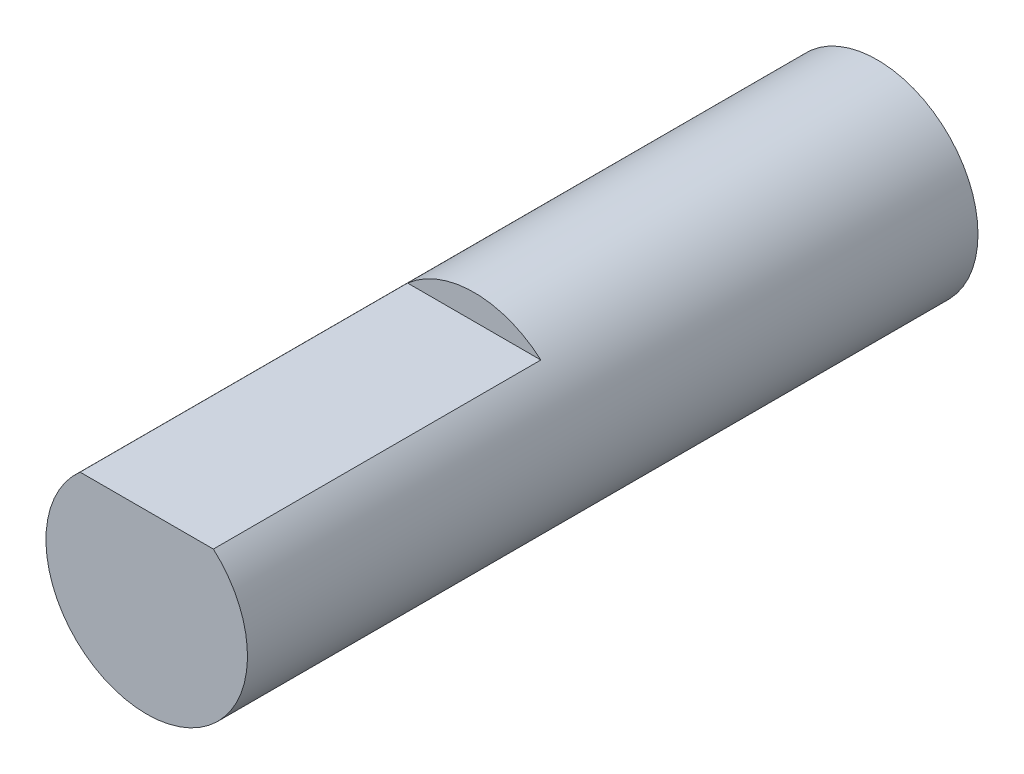
ISO-10303-21;
HEADER;
FILE_DESCRIPTION(('STEP AP214'),'2;1');
FILE_NAME('part.step','',(''),(''),'','','');
FILE_SCHEMA(('AUTOMOTIVE_DESIGN { 1 0 10303 214 1 1 1 1 }'));
ENDSEC;
DATA;
#1=APPLICATION_CONTEXT('core data for automotive mechanical design processes');
#2=APPLICATION_PROTOCOL_DEFINITION('international standard','automotive_design',2000,#1);
#3=PRODUCT_CONTEXT('',#1,'mechanical');
#4=PRODUCT('Part','Part','',(#3));
#5=PRODUCT_RELATED_PRODUCT_CATEGORY('part','',(#4));
#6=PRODUCT_DEFINITION_FORMATION('','',#4);
#7=PRODUCT_DEFINITION_CONTEXT('part definition',#1,'design');
#8=PRODUCT_DEFINITION('design','',#6,#7);
#9=PRODUCT_DEFINITION_SHAPE('','',#8);
#10=(LENGTH_UNIT() NAMED_UNIT(*) SI_UNIT(.MILLI.,.METRE.));
#11=(NAMED_UNIT(*) PLANE_ANGLE_UNIT() SI_UNIT($,.RADIAN.));
#12=(NAMED_UNIT(*) SI_UNIT($,.STERADIAN.) SOLID_ANGLE_UNIT());
#13=UNCERTAINTY_MEASURE_WITH_UNIT(LENGTH_MEASURE(1.E-05),#10,'distance_accuracy_value','');
#14=(GEOMETRIC_REPRESENTATION_CONTEXT(3) GLOBAL_UNCERTAINTY_ASSIGNED_CONTEXT((#13)) GLOBAL_UNIT_ASSIGNED_CONTEXT((#10,
#11,#12)) REPRESENTATION_CONTEXT('',''));
#15=CARTESIAN_POINT('',(0.,0.,0.));
#16=DIRECTION('',(0.,0.,1.));
#17=DIRECTION('',(1.,0.,0.));
#18=AXIS2_PLACEMENT_3D('',#15,#16,#17);
#19=CARTESIAN_POINT('',(0.,0.,29.));
#20=DIRECTION('',(0.,0.,-1.));
#21=DIRECTION('',(-1.,0.,0.));
#22=AXIS2_PLACEMENT_3D('',#19,#20,#21);
#23=CYLINDRICAL_SURFACE('',#22,4.);
#24=CARTESIAN_POINT('',(0.,0.,29.));
#25=DIRECTION('',(0.,0.,1.));
#26=DIRECTION('',(1.,0.,0.));
#27=AXIS2_PLACEMENT_3D('',#24,#25,#26);
#28=CIRCLE('',#27,4.);
#29=CARTESIAN_POINT('',(-2.64575131106459,3.,29.));
#30=VERTEX_POINT('',#29);
#31=CARTESIAN_POINT('',(2.64575131106459,3.,29.));
#32=VERTEX_POINT('',#31);
#33=EDGE_CURVE('E11',#30,#32,#28,.T.);
#34=ORIENTED_EDGE('',*,*,#33,.F.);
#35=DIRECTION('',(0.,0.,1.));
#36=VECTOR('',#35,1.);
#37=CARTESIAN_POINT('',(-2.64575131106459,3.,16.));
#38=LINE('',#37,#36);
#39=CARTESIAN_POINT('',(-2.64575131106459,3.,16.));
#40=VERTEX_POINT('',#39);
#41=EDGE_CURVE('E58',#40,#30,#38,.T.);
#42=ORIENTED_EDGE('',*,*,#41,.F.);
#43=CARTESIAN_POINT('',(0.,0.,16.));
#44=DIRECTION('',(0.,0.,1.));
#45=DIRECTION('',(-1.,0.,0.));
#46=AXIS2_PLACEMENT_3D('',#43,#44,#45);
#47=CIRCLE('',#46,4.);
#48=CARTESIAN_POINT('',(2.64575131106459,3.,16.));
#49=VERTEX_POINT('',#48);
#50=EDGE_CURVE('E74',#49,#40,#47,.T.);
#51=ORIENTED_EDGE('',*,*,#50,.F.);
#52=DIRECTION('',(0.,0.,1.));
#53=VECTOR('',#52,1.);
#54=CARTESIAN_POINT('',(2.64575131106459,3.,16.));
#55=LINE('',#54,#53);
#56=EDGE_CURVE('E64',#49,#32,#55,.T.);
#57=ORIENTED_EDGE('',*,*,#56,.T.);
#58=EDGE_LOOP('',(#34,#42,#51,#57));
#59=FACE_BOUND('',#58,.T.);
#60=CARTESIAN_POINT('',(0.,0.,0.));
#61=DIRECTION('',(0.,0.,1.));
#62=DIRECTION('',(1.,0.,0.));
#63=AXIS2_PLACEMENT_3D('',#60,#61,#62);
#64=CIRCLE('',#63,4.);
#65=CARTESIAN_POINT('',(4.,0.,0.));
#66=VERTEX_POINT('',#65);
#67=EDGE_CURVE('E46',#66,#66,#64,.T.);
#68=ORIENTED_EDGE('',*,*,#67,.T.);
#69=EDGE_LOOP('',(#68));
#70=FACE_BOUND('',#69,.T.);
#71=ADVANCED_FACE('F43',(#59,#70),#23,.T.);
#72=CARTESIAN_POINT('',(0.,0.,29.));
#73=DIRECTION('',(0.,0.,1.));
#74=DIRECTION('',(1.,0.,0.));
#75=AXIS2_PLACEMENT_3D('',#72,#73,#74);
#76=PLANE('',#75);
#77=DIRECTION('',(1.,0.,0.));
#78=VECTOR('',#77,1.);
#79=CARTESIAN_POINT('',(-2.64575131106459,3.,29.));
#80=LINE('',#79,#78);
#81=EDGE_CURVE('E69',#30,#32,#80,.T.);
#82=ORIENTED_EDGE('',*,*,#81,.F.);
#83=ORIENTED_EDGE('',*,*,#33,.T.);
#84=EDGE_LOOP('',(#82,#83));
#85=FACE_BOUND('',#84,.T.);
#86=ADVANCED_FACE('F81',(#85),#76,.T.);
#87=CARTESIAN_POINT('',(0.,0.,0.));
#88=DIRECTION('',(0.,0.,1.));
#89=DIRECTION('',(1.,0.,0.));
#90=AXIS2_PLACEMENT_3D('',#87,#88,#89);
#91=PLANE('',#90);
#92=ORIENTED_EDGE('',*,*,#67,.F.);
#93=EDGE_LOOP('',(#92));
#94=FACE_BOUND('',#93,.T.);
#95=ADVANCED_FACE('F83',(#94),#91,.F.);
#96=CARTESIAN_POINT('',(-2.64575131106459,3.,16.));
#97=DIRECTION('',(0.,-1.,0.));
#98=DIRECTION('',(0.,0.,-1.));
#99=AXIS2_PLACEMENT_3D('',#96,#97,#98);
#100=PLANE('',#99);
#101=ORIENTED_EDGE('',*,*,#81,.T.);
#102=ORIENTED_EDGE('',*,*,#56,.F.);
#103=DIRECTION('',(1.,0.,0.));
#104=VECTOR('',#103,1.);
#105=CARTESIAN_POINT('',(-2.64575131106459,3.,16.));
#106=LINE('',#105,#104);
#107=EDGE_CURVE('E98',#40,#49,#106,.T.);
#108=ORIENTED_EDGE('',*,*,#107,.F.);
#109=ORIENTED_EDGE('',*,*,#41,.T.);
#110=EDGE_LOOP('',(#101,#102,#108,#109));
#111=FACE_BOUND('',#110,.T.);
#112=ADVANCED_FACE('F70',(#111),#100,.F.);
#113=CARTESIAN_POINT('',(0.,0.,16.));
#114=DIRECTION('',(0.,0.,-1.));
#115=DIRECTION('',(-1.,0.,0.));
#116=AXIS2_PLACEMENT_3D('',#113,#114,#115);
#117=PLANE('',#116);
#118=ORIENTED_EDGE('',*,*,#50,.T.);
#119=ORIENTED_EDGE('',*,*,#107,.T.);
#120=EDGE_LOOP('',(#118,#119));
#121=FACE_BOUND('',#120,.T.);
#122=ADVANCED_FACE('F93',(#121),#117,.F.);
#123=CLOSED_SHELL('',(#71,#86,#95,#112,#122));
#124=MANIFOLD_SOLID_BREP('B2',#123);
#125=ADVANCED_BREP_SHAPE_REPRESENTATION('',(#18,#124),#14);
#126=SHAPE_DEFINITION_REPRESENTATION(#9,#125);
ENDSEC;
END-ISO-10303-21;
